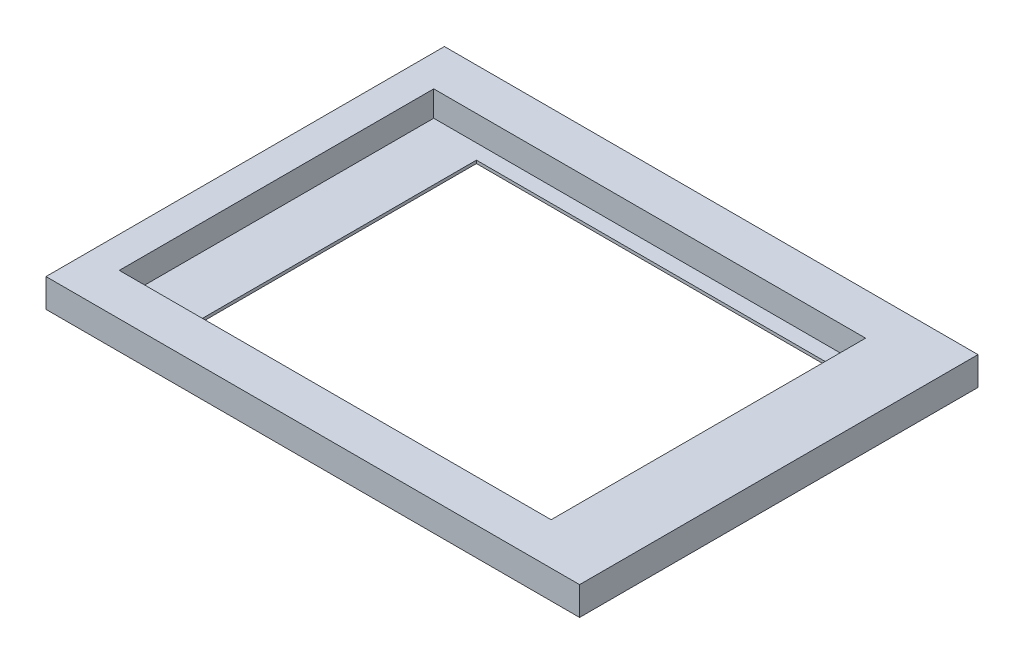
ISO-10303-21;
HEADER;
FILE_DESCRIPTION(('STEP AP214'),'2;1');
FILE_NAME('part.step','',(''),(''),'','','');
FILE_SCHEMA(('AUTOMOTIVE_DESIGN { 1 0 10303 214 1 1 1 1 }'));
ENDSEC;
DATA;
#1=APPLICATION_CONTEXT('core data for automotive mechanical design processes');
#2=APPLICATION_PROTOCOL_DEFINITION('international standard','automotive_design',2000,#1);
#3=PRODUCT_CONTEXT('',#1,'mechanical');
#4=PRODUCT('Part','Part','',(#3));
#5=PRODUCT_RELATED_PRODUCT_CATEGORY('part','',(#4));
#6=PRODUCT_DEFINITION_FORMATION('','',#4);
#7=PRODUCT_DEFINITION_CONTEXT('part definition',#1,'design');
#8=PRODUCT_DEFINITION('design','',#6,#7);
#9=PRODUCT_DEFINITION_SHAPE('','',#8);
#10=(LENGTH_UNIT() NAMED_UNIT(*) SI_UNIT(.MILLI.,.METRE.));
#11=(NAMED_UNIT(*) PLANE_ANGLE_UNIT() SI_UNIT($,.RADIAN.));
#12=(NAMED_UNIT(*) SI_UNIT($,.STERADIAN.) SOLID_ANGLE_UNIT());
#13=UNCERTAINTY_MEASURE_WITH_UNIT(LENGTH_MEASURE(1.E-05),#10,'distance_accuracy_value','');
#14=(GEOMETRIC_REPRESENTATION_CONTEXT(3) GLOBAL_UNCERTAINTY_ASSIGNED_CONTEXT((#13)) GLOBAL_UNIT_ASSIGNED_CONTEXT((#10,
#11,#12)) REPRESENTATION_CONTEXT('',''));
#15=CARTESIAN_POINT('',(0.,0.,0.));
#16=DIRECTION('',(0.,0.,1.));
#17=DIRECTION('',(1.,0.,0.));
#18=AXIS2_PLACEMENT_3D('',#15,#16,#17);
#19=CARTESIAN_POINT('',(-62.5,0.,-48.));
#20=DIRECTION('',(-1.,0.,0.));
#21=DIRECTION('',(0.,0.,1.));
#22=AXIS2_PLACEMENT_3D('',#19,#20,#21);
#23=PLANE('',#22);
#24=DIRECTION('',(0.,0.,-1.));
#25=VECTOR('',#24,1.);
#26=CARTESIAN_POINT('',(-62.5,0.42,-48.));
#27=LINE('',#26,#25);
#28=CARTESIAN_POINT('',(-62.5,0.42,-8.));
#29=VERTEX_POINT('',#28);
#30=CARTESIAN_POINT('',(-62.5,0.42,-48.));
#31=VERTEX_POINT('',#30);
#32=EDGE_CURVE('E161',#29,#31,#27,.T.);
#33=ORIENTED_EDGE('',*,*,#32,.F.);
#34=DIRECTION('',(0.,1.,0.));
#35=VECTOR('',#34,1.);
#36=CARTESIAN_POINT('',(-62.5,0.,-8.));
#37=LINE('',#36,#35);
#38=CARTESIAN_POINT('',(-62.5,0.,-8.));
#39=VERTEX_POINT('',#38);
#40=EDGE_CURVE('E175',#39,#29,#37,.T.);
#41=ORIENTED_EDGE('',*,*,#40,.F.);
#42=DIRECTION('',(0.,0.,1.));
#43=VECTOR('',#42,1.);
#44=CARTESIAN_POINT('',(-62.5,0.,-48.));
#45=LINE('',#44,#43);
#46=CARTESIAN_POINT('',(-62.5,0.,-48.));
#47=VERTEX_POINT('',#46);
#48=EDGE_CURVE('E163',#47,#39,#45,.T.);
#49=ORIENTED_EDGE('',*,*,#48,.F.);
#50=DIRECTION('',(0.,1.,0.));
#51=VECTOR('',#50,1.);
#52=CARTESIAN_POINT('',(-62.5,0.,-48.));
#53=LINE('',#52,#51);
#54=EDGE_CURVE('E176',#47,#31,#53,.T.);
#55=ORIENTED_EDGE('',*,*,#54,.T.);
#56=EDGE_LOOP('',(#33,#41,#49,#55));
#57=FACE_BOUND('',#56,.T.);
#58=ADVANCED_FACE('F32',(#57),#23,.F.);
#59=CARTESIAN_POINT('',(-62.5,0.,-48.));
#60=DIRECTION('',(0.,0.,-1.));
#61=DIRECTION('',(-1.,0.,0.));
#62=AXIS2_PLACEMENT_3D('',#59,#60,#61);
#63=PLANE('',#62);
#64=DIRECTION('',(1.,0.,0.));
#65=VECTOR('',#64,1.);
#66=CARTESIAN_POINT('',(-62.5,0.42,-48.));
#67=LINE('',#66,#65);
#68=CARTESIAN_POINT('',(-12.5,0.42,-48.));
#69=VERTEX_POINT('',#68);
#70=EDGE_CURVE('E159',#31,#69,#67,.T.);
#71=ORIENTED_EDGE('',*,*,#70,.F.);
#72=ORIENTED_EDGE('',*,*,#54,.F.);
#73=DIRECTION('',(-1.,0.,0.));
#74=VECTOR('',#73,1.);
#75=CARTESIAN_POINT('',(-62.5,0.,-48.));
#76=LINE('',#75,#74);
#77=CARTESIAN_POINT('',(-12.5,0.,-48.));
#78=VERTEX_POINT('',#77);
#79=EDGE_CURVE('E172',#78,#47,#76,.T.);
#80=ORIENTED_EDGE('',*,*,#79,.F.);
#81=DIRECTION('',(0.,1.,0.));
#82=VECTOR('',#81,1.);
#83=CARTESIAN_POINT('',(-12.5,0.,-48.));
#84=LINE('',#83,#82);
#85=EDGE_CURVE('E180',#78,#69,#84,.T.);
#86=ORIENTED_EDGE('',*,*,#85,.T.);
#87=EDGE_LOOP('',(#71,#72,#80,#86));
#88=FACE_BOUND('',#87,.T.);
#89=ADVANCED_FACE('F247',(#88),#63,.F.);
#90=CARTESIAN_POINT('',(-12.5,0.,-48.));
#91=DIRECTION('',(1.,0.,0.));
#92=DIRECTION('',(0.,0.,-1.));
#93=AXIS2_PLACEMENT_3D('',#90,#91,#92);
#94=PLANE('',#93);
#95=DIRECTION('',(0.,0.,1.));
#96=VECTOR('',#95,1.);
#97=CARTESIAN_POINT('',(-12.5,0.42,-48.));
#98=LINE('',#97,#96);
#99=CARTESIAN_POINT('',(-12.5,0.42,-8.));
#100=VERTEX_POINT('',#99);
#101=EDGE_CURVE('E54',#69,#100,#98,.T.);
#102=ORIENTED_EDGE('',*,*,#101,.F.);
#103=ORIENTED_EDGE('',*,*,#85,.F.);
#104=DIRECTION('',(0.,0.,-1.));
#105=VECTOR('',#104,1.);
#106=CARTESIAN_POINT('',(-12.5,0.,-48.));
#107=LINE('',#106,#105);
#108=CARTESIAN_POINT('',(-12.5,0.,-8.));
#109=VERTEX_POINT('',#108);
#110=EDGE_CURVE('E169',#109,#78,#107,.T.);
#111=ORIENTED_EDGE('',*,*,#110,.F.);
#112=DIRECTION('',(0.,1.,0.));
#113=VECTOR('',#112,1.);
#114=CARTESIAN_POINT('',(-12.5,0.,-8.));
#115=LINE('',#114,#113);
#116=EDGE_CURVE('E183',#109,#100,#115,.T.);
#117=ORIENTED_EDGE('',*,*,#116,.T.);
#118=EDGE_LOOP('',(#102,#103,#111,#117));
#119=FACE_BOUND('',#118,.T.);
#120=ADVANCED_FACE('F252',(#119),#94,.F.);
#121=CARTESIAN_POINT('',(-62.5,0.,-8.));
#122=DIRECTION('',(0.,0.,1.));
#123=DIRECTION('',(1.,0.,0.));
#124=AXIS2_PLACEMENT_3D('',#121,#122,#123);
#125=PLANE('',#124);
#126=DIRECTION('',(-1.,0.,0.));
#127=VECTOR('',#126,1.);
#128=CARTESIAN_POINT('',(-62.5,0.42,-8.));
#129=LINE('',#128,#127);
#130=EDGE_CURVE('E11',#100,#29,#129,.T.);
#131=ORIENTED_EDGE('',*,*,#130,.F.);
#132=ORIENTED_EDGE('',*,*,#116,.F.);
#133=DIRECTION('',(1.,0.,0.));
#134=VECTOR('',#133,1.);
#135=CARTESIAN_POINT('',(-62.5,0.,-8.));
#136=LINE('',#135,#134);
#137=EDGE_CURVE('E166',#39,#109,#136,.T.);
#138=ORIENTED_EDGE('',*,*,#137,.F.);
#139=ORIENTED_EDGE('',*,*,#40,.T.);
#140=EDGE_LOOP('',(#131,#132,#138,#139));
#141=FACE_BOUND('',#140,.T.);
#142=ADVANCED_FACE('F257',(#141),#125,.F.);
#143=CARTESIAN_POINT('',(0.,4.,0.));
#144=DIRECTION('',(-1.,0.,0.));
#145=DIRECTION('',(0.,0.,1.));
#146=AXIS2_PLACEMENT_3D('',#143,#144,#145);
#147=PLANE('',#146);
#148=DIRECTION('',(0.,0.,-1.));
#149=VECTOR('',#148,1.);
#150=CARTESIAN_POINT('',(0.,0.,0.));
#151=LINE('',#150,#149);
#152=CARTESIAN_POINT('',(0.,0.,0.));
#153=VERTEX_POINT('',#152);
#154=CARTESIAN_POINT('',(0.,0.,-56.));
#155=VERTEX_POINT('',#154);
#156=EDGE_CURVE('E179',#153,#155,#151,.T.);
#157=ORIENTED_EDGE('',*,*,#156,.T.);
#158=DIRECTION('',(0.,-1.,0.));
#159=VECTOR('',#158,1.);
#160=CARTESIAN_POINT('',(0.,4.,-56.));
#161=LINE('',#160,#159);
#162=CARTESIAN_POINT('',(0.,4.,-56.));
#163=VERTEX_POINT('',#162);
#164=EDGE_CURVE('E40',#163,#155,#161,.T.);
#165=ORIENTED_EDGE('',*,*,#164,.F.);
#166=DIRECTION('',(0.,0.,-1.));
#167=VECTOR('',#166,1.);
#168=CARTESIAN_POINT('',(0.,4.,0.));
#169=LINE('',#168,#167);
#170=CARTESIAN_POINT('',(0.,4.,0.));
#171=VERTEX_POINT('',#170);
#172=EDGE_CURVE('E188',#171,#163,#169,.T.);
#173=ORIENTED_EDGE('',*,*,#172,.F.);
#174=DIRECTION('',(0.,-1.,0.));
#175=VECTOR('',#174,1.);
#176=CARTESIAN_POINT('',(0.,4.,0.));
#177=LINE('',#176,#175);
#178=EDGE_CURVE('E198',#171,#153,#177,.T.);
#179=ORIENTED_EDGE('',*,*,#178,.T.);
#180=EDGE_LOOP('',(#157,#165,#173,#179));
#181=FACE_BOUND('',#180,.T.);
#182=ADVANCED_FACE('F34',(#181),#147,.F.);
#183=CARTESIAN_POINT('',(0.,4.,-56.));
#184=DIRECTION('',(0.,0.,1.));
#185=DIRECTION('',(1.,0.,0.));
#186=AXIS2_PLACEMENT_3D('',#183,#184,#185);
#187=PLANE('',#186);
#188=DIRECTION('',(-1.,0.,0.));
#189=VECTOR('',#188,1.);
#190=CARTESIAN_POINT('',(0.,0.,-56.));
#191=LINE('',#190,#189);
#192=CARTESIAN_POINT('',(-75.,0.,-56.));
#193=VERTEX_POINT('',#192);
#194=EDGE_CURVE('E201',#155,#193,#191,.T.);
#195=ORIENTED_EDGE('',*,*,#194,.T.);
#196=DIRECTION('',(0.,-1.,0.));
#197=VECTOR('',#196,1.);
#198=CARTESIAN_POINT('',(-75.,4.,-56.));
#199=LINE('',#198,#197);
#200=CARTESIAN_POINT('',(-75.,4.,-56.));
#201=VERTEX_POINT('',#200);
#202=EDGE_CURVE('E211',#201,#193,#199,.T.);
#203=ORIENTED_EDGE('',*,*,#202,.F.);
#204=DIRECTION('',(-1.,0.,0.));
#205=VECTOR('',#204,1.);
#206=CARTESIAN_POINT('',(0.,4.,-56.));
#207=LINE('',#206,#205);
#208=EDGE_CURVE('E191',#163,#201,#207,.T.);
#209=ORIENTED_EDGE('',*,*,#208,.F.);
#210=ORIENTED_EDGE('',*,*,#164,.T.);
#211=EDGE_LOOP('',(#195,#203,#209,#210));
#212=FACE_BOUND('',#211,.T.);
#213=ADVANCED_FACE('F216',(#212),#187,.F.);
#214=CARTESIAN_POINT('',(-75.,4.,0.));
#215=DIRECTION('',(1.,0.,0.));
#216=DIRECTION('',(0.,0.,-1.));
#217=AXIS2_PLACEMENT_3D('',#214,#215,#216);
#218=PLANE('',#217);
#219=DIRECTION('',(0.,0.,1.));
#220=VECTOR('',#219,1.);
#221=CARTESIAN_POINT('',(-75.,0.,0.));
#222=LINE('',#221,#220);
#223=CARTESIAN_POINT('',(-75.,0.,0.));
#224=VERTEX_POINT('',#223);
#225=EDGE_CURVE('E203',#193,#224,#222,.T.);
#226=ORIENTED_EDGE('',*,*,#225,.T.);
#227=DIRECTION('',(0.,-1.,0.));
#228=VECTOR('',#227,1.);
#229=CARTESIAN_POINT('',(-75.,4.,0.));
#230=LINE('',#229,#228);
#231=CARTESIAN_POINT('',(-75.,4.,0.));
#232=VERTEX_POINT('',#231);
#233=EDGE_CURVE('E208',#232,#224,#230,.T.);
#234=ORIENTED_EDGE('',*,*,#233,.F.);
#235=DIRECTION('',(0.,0.,1.));
#236=VECTOR('',#235,1.);
#237=CARTESIAN_POINT('',(-75.,4.,0.));
#238=LINE('',#237,#236);
#239=EDGE_CURVE('E194',#201,#232,#238,.T.);
#240=ORIENTED_EDGE('',*,*,#239,.F.);
#241=ORIENTED_EDGE('',*,*,#202,.T.);
#242=EDGE_LOOP('',(#226,#234,#240,#241));
#243=FACE_BOUND('',#242,.T.);
#244=ADVANCED_FACE('F228',(#243),#218,.F.);
#245=CARTESIAN_POINT('',(0.,4.,0.));
#246=DIRECTION('',(0.,0.,-1.));
#247=DIRECTION('',(-1.,0.,0.));
#248=AXIS2_PLACEMENT_3D('',#245,#246,#247);
#249=PLANE('',#248);
#250=DIRECTION('',(1.,0.,0.));
#251=VECTOR('',#250,1.);
#252=CARTESIAN_POINT('',(0.,0.,0.));
#253=LINE('',#252,#251);
#254=EDGE_CURVE('E192',#224,#153,#253,.T.);
#255=ORIENTED_EDGE('',*,*,#254,.T.);
#256=ORIENTED_EDGE('',*,*,#178,.F.);
#257=DIRECTION('',(1.,0.,0.));
#258=VECTOR('',#257,1.);
#259=CARTESIAN_POINT('',(0.,4.,0.));
#260=LINE('',#259,#258);
#261=EDGE_CURVE('E196',#232,#171,#260,.T.);
#262=ORIENTED_EDGE('',*,*,#261,.F.);
#263=ORIENTED_EDGE('',*,*,#233,.T.);
#264=EDGE_LOOP('',(#255,#256,#262,#263));
#265=FACE_BOUND('',#264,.T.);
#266=ADVANCED_FACE('F232',(#265),#249,.F.);
#267=CARTESIAN_POINT('',(0.,4.,0.));
#268=DIRECTION('',(0.,1.,0.));
#269=DIRECTION('',(0.,0.,1.));
#270=AXIS2_PLACEMENT_3D('',#267,#268,#269);
#271=PLANE('',#270);
#272=DIRECTION('',(0.,0.,1.));
#273=VECTOR('',#272,1.);
#274=CARTESIAN_POINT('',(-70.6,4.,-50.1));
#275=LINE('',#274,#273);
#276=CARTESIAN_POINT('',(-70.6,4.,-50.1));
#277=VERTEX_POINT('',#276);
#278=CARTESIAN_POINT('',(-70.6,4.,-5.9));
#279=VERTEX_POINT('',#278);
#280=EDGE_CURVE('E47',#277,#279,#275,.T.);
#281=ORIENTED_EDGE('',*,*,#280,.F.);
#282=DIRECTION('',(-1.,0.,0.));
#283=VECTOR('',#282,1.);
#284=CARTESIAN_POINT('',(-70.6,4.,-50.1));
#285=LINE('',#284,#283);
#286=CARTESIAN_POINT('',(-9.89999999999999,4.,-50.1));
#287=VERTEX_POINT('',#286);
#288=EDGE_CURVE('E140',#287,#277,#285,.T.);
#289=ORIENTED_EDGE('',*,*,#288,.F.);
#290=DIRECTION('',(0.,0.,-1.));
#291=VECTOR('',#290,1.);
#292=CARTESIAN_POINT('',(-9.89999999999999,4.,-50.1));
#293=LINE('',#292,#291);
#294=CARTESIAN_POINT('',(-9.89999999999998,4.,-5.9));
#295=VERTEX_POINT('',#294);
#296=EDGE_CURVE('E143',#295,#287,#293,.T.);
#297=ORIENTED_EDGE('',*,*,#296,.F.);
#298=DIRECTION('',(1.,0.,0.));
#299=VECTOR('',#298,1.);
#300=CARTESIAN_POINT('',(-70.6,4.,-5.9));
#301=LINE('',#300,#299);
#302=EDGE_CURVE('E149',#279,#295,#301,.T.);
#303=ORIENTED_EDGE('',*,*,#302,.F.);
#304=EDGE_LOOP('',(#281,#289,#297,#303));
#305=FACE_BOUND('',#304,.T.);
#306=ORIENTED_EDGE('',*,*,#172,.T.);
#307=ORIENTED_EDGE('',*,*,#208,.T.);
#308=ORIENTED_EDGE('',*,*,#239,.T.);
#309=ORIENTED_EDGE('',*,*,#261,.T.);
#310=EDGE_LOOP('',(#306,#307,#308,#309));
#311=FACE_BOUND('',#310,.T.);
#312=ADVANCED_FACE('F234',(#305,#311),#271,.T.);
#313=CARTESIAN_POINT('',(0.,0.,0.));
#314=DIRECTION('',(0.,1.,0.));
#315=DIRECTION('',(0.,0.,1.));
#316=AXIS2_PLACEMENT_3D('',#313,#314,#315);
#317=PLANE('',#316);
#318=ORIENTED_EDGE('',*,*,#79,.T.);
#319=ORIENTED_EDGE('',*,*,#48,.T.);
#320=ORIENTED_EDGE('',*,*,#137,.T.);
#321=ORIENTED_EDGE('',*,*,#110,.T.);
#322=EDGE_LOOP('',(#318,#319,#320,#321));
#323=FACE_BOUND('',#322,.T.);
#324=ORIENTED_EDGE('',*,*,#156,.F.);
#325=ORIENTED_EDGE('',*,*,#254,.F.);
#326=ORIENTED_EDGE('',*,*,#225,.F.);
#327=ORIENTED_EDGE('',*,*,#194,.F.);
#328=EDGE_LOOP('',(#324,#325,#326,#327));
#329=FACE_BOUND('',#328,.T.);
#330=ADVANCED_FACE('F224',(#323,#329),#317,.F.);
#331=CARTESIAN_POINT('',(0.,0.42,0.));
#332=DIRECTION('',(0.,1.,0.));
#333=DIRECTION('',(0.,0.,1.));
#334=AXIS2_PLACEMENT_3D('',#331,#332,#333);
#335=PLANE('',#334);
#336=DIRECTION('',(0.,0.,1.));
#337=VECTOR('',#336,1.);
#338=CARTESIAN_POINT('',(-70.6,0.42,-50.1));
#339=LINE('',#338,#337);
#340=CARTESIAN_POINT('',(-70.6,0.42,-50.1));
#341=VERTEX_POINT('',#340);
#342=CARTESIAN_POINT('',(-70.6,0.42,-5.9));
#343=VERTEX_POINT('',#342);
#344=EDGE_CURVE('E122',#341,#343,#339,.T.);
#345=ORIENTED_EDGE('',*,*,#344,.T.);
#346=DIRECTION('',(1.,0.,0.));
#347=VECTOR('',#346,1.);
#348=CARTESIAN_POINT('',(-70.6,0.42,-5.9));
#349=LINE('',#348,#347);
#350=CARTESIAN_POINT('',(-9.89999999999998,0.42,-5.9));
#351=VERTEX_POINT('',#350);
#352=EDGE_CURVE('E131',#343,#351,#349,.T.);
#353=ORIENTED_EDGE('',*,*,#352,.T.);
#354=DIRECTION('',(0.,0.,-1.));
#355=VECTOR('',#354,1.);
#356=CARTESIAN_POINT('',(-9.89999999999999,0.42,-50.1));
#357=LINE('',#356,#355);
#358=CARTESIAN_POINT('',(-9.89999999999999,0.42,-50.1));
#359=VERTEX_POINT('',#358);
#360=EDGE_CURVE('E136',#351,#359,#357,.T.);
#361=ORIENTED_EDGE('',*,*,#360,.T.);
#362=DIRECTION('',(-1.,0.,0.));
#363=VECTOR('',#362,1.);
#364=CARTESIAN_POINT('',(-70.6,0.42,-50.1));
#365=LINE('',#364,#363);
#366=EDGE_CURVE('E128',#359,#341,#365,.T.);
#367=ORIENTED_EDGE('',*,*,#366,.T.);
#368=EDGE_LOOP('',(#345,#353,#361,#367));
#369=FACE_BOUND('',#368,.T.);
#370=ORIENTED_EDGE('',*,*,#32,.T.);
#371=ORIENTED_EDGE('',*,*,#70,.T.);
#372=ORIENTED_EDGE('',*,*,#101,.T.);
#373=ORIENTED_EDGE('',*,*,#130,.T.);
#374=EDGE_LOOP('',(#370,#371,#372,#373));
#375=FACE_BOUND('',#374,.T.);
#376=ADVANCED_FACE('F138',(#369,#375),#335,.T.);
#377=CARTESIAN_POINT('',(-70.6,0.42,-50.1));
#378=DIRECTION('',(-1.,0.,0.));
#379=DIRECTION('',(0.,0.,1.));
#380=AXIS2_PLACEMENT_3D('',#377,#378,#379);
#381=PLANE('',#380);
#382=ORIENTED_EDGE('',*,*,#280,.T.);
#383=DIRECTION('',(0.,1.,0.));
#384=VECTOR('',#383,1.);
#385=CARTESIAN_POINT('',(-70.6,0.42,-5.9));
#386=LINE('',#385,#384);
#387=EDGE_CURVE('E118',#343,#279,#386,.T.);
#388=ORIENTED_EDGE('',*,*,#387,.F.);
#389=ORIENTED_EDGE('',*,*,#344,.F.);
#390=DIRECTION('',(0.,1.,0.));
#391=VECTOR('',#390,1.);
#392=CARTESIAN_POINT('',(-70.6,0.42,-50.1));
#393=LINE('',#392,#391);
#394=EDGE_CURVE('E153',#341,#277,#393,.T.);
#395=ORIENTED_EDGE('',*,*,#394,.T.);
#396=EDGE_LOOP('',(#382,#388,#389,#395));
#397=FACE_BOUND('',#396,.T.);
#398=ADVANCED_FACE('F120',(#397),#381,.F.);
#399=CARTESIAN_POINT('',(-70.6,0.42,-50.1));
#400=DIRECTION('',(0.,0.,-1.));
#401=DIRECTION('',(-1.,0.,0.));
#402=AXIS2_PLACEMENT_3D('',#399,#400,#401);
#403=PLANE('',#402);
#404=ORIENTED_EDGE('',*,*,#288,.T.);
#405=ORIENTED_EDGE('',*,*,#394,.F.);
#406=ORIENTED_EDGE('',*,*,#366,.F.);
#407=DIRECTION('',(0.,1.,0.));
#408=VECTOR('',#407,1.);
#409=CARTESIAN_POINT('',(-9.89999999999999,0.42,-50.1));
#410=LINE('',#409,#408);
#411=EDGE_CURVE('E155',#359,#287,#410,.T.);
#412=ORIENTED_EDGE('',*,*,#411,.T.);
#413=EDGE_LOOP('',(#404,#405,#406,#412));
#414=FACE_BOUND('',#413,.T.);
#415=ADVANCED_FACE('F266',(#414),#403,.F.);
#416=CARTESIAN_POINT('',(-9.89999999999999,0.42,-50.1));
#417=DIRECTION('',(1.,0.,0.));
#418=DIRECTION('',(0.,0.,-1.));
#419=AXIS2_PLACEMENT_3D('',#416,#417,#418);
#420=PLANE('',#419);
#421=ORIENTED_EDGE('',*,*,#296,.T.);
#422=ORIENTED_EDGE('',*,*,#411,.F.);
#423=ORIENTED_EDGE('',*,*,#360,.F.);
#424=DIRECTION('',(0.,1.,0.));
#425=VECTOR('',#424,1.);
#426=CARTESIAN_POINT('',(-9.89999999999998,0.42,-5.9));
#427=LINE('',#426,#425);
#428=EDGE_CURVE('E127',#351,#295,#427,.T.);
#429=ORIENTED_EDGE('',*,*,#428,.T.);
#430=EDGE_LOOP('',(#421,#422,#423,#429));
#431=FACE_BOUND('',#430,.T.);
#432=ADVANCED_FACE('F269',(#431),#420,.F.);
#433=CARTESIAN_POINT('',(-70.6,0.42,-5.9));
#434=DIRECTION('',(0.,0.,1.));
#435=DIRECTION('',(1.,0.,0.));
#436=AXIS2_PLACEMENT_3D('',#433,#434,#435);
#437=PLANE('',#436);
#438=ORIENTED_EDGE('',*,*,#302,.T.);
#439=ORIENTED_EDGE('',*,*,#428,.F.);
#440=ORIENTED_EDGE('',*,*,#352,.F.);
#441=ORIENTED_EDGE('',*,*,#387,.T.);
#442=EDGE_LOOP('',(#438,#439,#440,#441));
#443=FACE_BOUND('',#442,.T.);
#444=ADVANCED_FACE('F132',(#443),#437,.F.);
#445=CLOSED_SHELL('',(#58,#89,#120,#142,#182,#213,#244,#266,#312,#330,#376,#398,#415,#432,#444));
#446=MANIFOLD_SOLID_BREP('B2',#445);
#447=ADVANCED_BREP_SHAPE_REPRESENTATION('',(#18,#446),#14);
#448=SHAPE_DEFINITION_REPRESENTATION(#9,#447);
ENDSEC;
END-ISO-10303-21;
